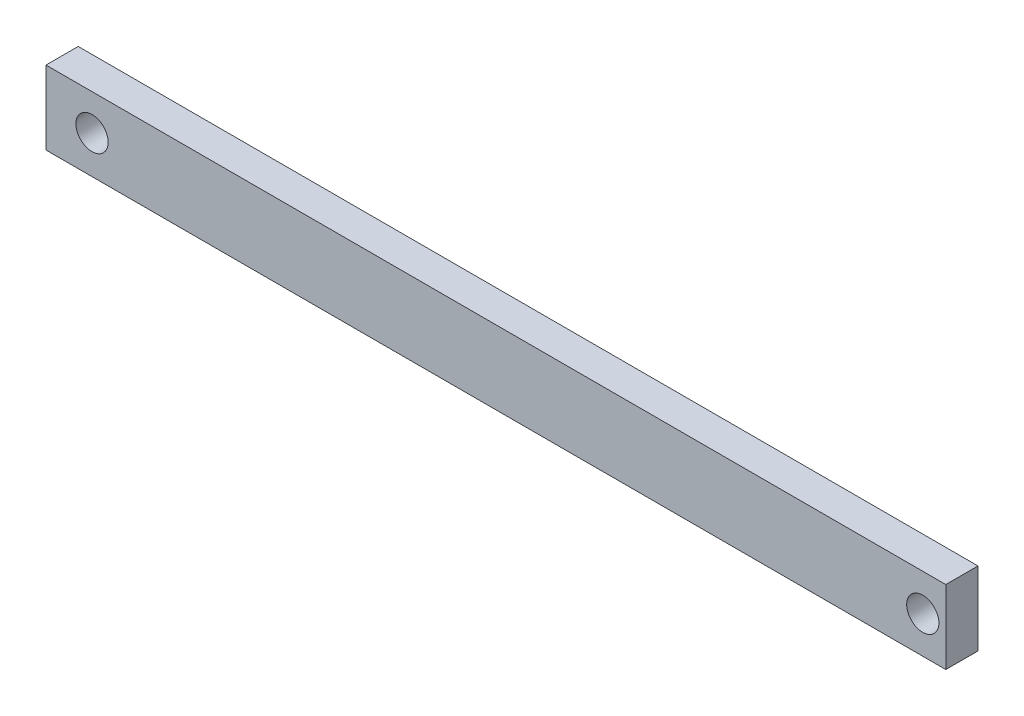
ISO-10303-21;
HEADER;
FILE_DESCRIPTION(('STEP AP214'),'2;1');
FILE_NAME('part.step','',(''),(''),'','','');
FILE_SCHEMA(('AUTOMOTIVE_DESIGN { 1 0 10303 214 1 1 1 1 }'));
ENDSEC;
DATA;
#1=APPLICATION_CONTEXT('core data for automotive mechanical design processes');
#2=APPLICATION_PROTOCOL_DEFINITION('international standard','automotive_design',2000,#1);
#3=PRODUCT_CONTEXT('',#1,'mechanical');
#4=PRODUCT('Part','Part','',(#3));
#5=PRODUCT_RELATED_PRODUCT_CATEGORY('part','',(#4));
#6=PRODUCT_DEFINITION_FORMATION('','',#4);
#7=PRODUCT_DEFINITION_CONTEXT('part definition',#1,'design');
#8=PRODUCT_DEFINITION('design','',#6,#7);
#9=PRODUCT_DEFINITION_SHAPE('','',#8);
#10=(LENGTH_UNIT() NAMED_UNIT(*) SI_UNIT(.MILLI.,.METRE.));
#11=(NAMED_UNIT(*) PLANE_ANGLE_UNIT() SI_UNIT($,.RADIAN.));
#12=(NAMED_UNIT(*) SI_UNIT($,.STERADIAN.) SOLID_ANGLE_UNIT());
#13=UNCERTAINTY_MEASURE_WITH_UNIT(LENGTH_MEASURE(1.E-05),#10,'distance_accuracy_value','');
#14=(GEOMETRIC_REPRESENTATION_CONTEXT(3) GLOBAL_UNCERTAINTY_ASSIGNED_CONTEXT((#13)) GLOBAL_UNIT_ASSIGNED_CONTEXT((#10,
#11,#12)) REPRESENTATION_CONTEXT('',''));
#15=CARTESIAN_POINT('',(0.,0.,0.));
#16=DIRECTION('',(0.,0.,1.));
#17=DIRECTION('',(1.,0.,0.));
#18=AXIS2_PLACEMENT_3D('',#15,#16,#17);
#19=CARTESIAN_POINT('',(-237.857142857143,26.2857142857143,14.));
#20=DIRECTION('',(1.,0.,0.));
#21=DIRECTION('',(0.,0.,-1.));
#22=AXIS2_PLACEMENT_3D('',#19,#20,#21);
#23=PLANE('',#22);
#24=DIRECTION('',(0.,-1.,0.));
#25=VECTOR('',#24,1.);
#26=CARTESIAN_POINT('',(-237.857142857143,26.2857142857143,0.));
#27=LINE('',#26,#25);
#28=CARTESIAN_POINT('',(-237.857142857143,26.2857142857143,0.));
#29=VERTEX_POINT('',#28);
#30=CARTESIAN_POINT('',(-237.857142857143,-5.71428571428572,0.));
#31=VERTEX_POINT('',#30);
#32=EDGE_CURVE('E102',#29,#31,#27,.T.);
#33=ORIENTED_EDGE('',*,*,#32,.T.);
#34=DIRECTION('',(0.,0.,-1.));
#35=VECTOR('',#34,1.);
#36=CARTESIAN_POINT('',(-237.857142857143,-5.71428571428572,14.));
#37=LINE('',#36,#35);
#38=CARTESIAN_POINT('',(-237.857142857143,-5.71428571428572,14.));
#39=VERTEX_POINT('',#38);
#40=EDGE_CURVE('E11',#39,#31,#37,.T.);
#41=ORIENTED_EDGE('',*,*,#40,.F.);
#42=DIRECTION('',(0.,-1.,0.));
#43=VECTOR('',#42,1.);
#44=CARTESIAN_POINT('',(-237.857142857143,26.2857142857143,14.));
#45=LINE('',#44,#43);
#46=CARTESIAN_POINT('',(-237.857142857143,26.2857142857143,14.));
#47=VERTEX_POINT('',#46);
#48=EDGE_CURVE('E90',#47,#39,#45,.T.);
#49=ORIENTED_EDGE('',*,*,#48,.F.);
#50=DIRECTION('',(0.,0.,-1.));
#51=VECTOR('',#50,1.);
#52=CARTESIAN_POINT('',(-237.857142857143,26.2857142857143,14.));
#53=LINE('',#52,#51);
#54=EDGE_CURVE('E98',#47,#29,#53,.T.);
#55=ORIENTED_EDGE('',*,*,#54,.T.);
#56=EDGE_LOOP('',(#33,#41,#49,#55));
#57=FACE_BOUND('',#56,.T.);
#58=ADVANCED_FACE('F39',(#57),#23,.F.);
#59=CARTESIAN_POINT('',(-237.857142857143,-5.71428571428572,14.));
#60=DIRECTION('',(0.,1.,0.));
#61=DIRECTION('',(0.,0.,1.));
#62=AXIS2_PLACEMENT_3D('',#59,#60,#61);
#63=PLANE('',#62);
#64=DIRECTION('',(1.,0.,0.));
#65=VECTOR('',#64,1.);
#66=CARTESIAN_POINT('',(-237.857142857143,-5.71428571428572,0.));
#67=LINE('',#66,#65);
#68=CARTESIAN_POINT('',(153.142857142857,-5.71428571428572,0.));
#69=VERTEX_POINT('',#68);
#70=EDGE_CURVE('E94',#31,#69,#67,.T.);
#71=ORIENTED_EDGE('',*,*,#70,.T.);
#72=DIRECTION('',(0.,0.,-1.));
#73=VECTOR('',#72,1.);
#74=CARTESIAN_POINT('',(153.142857142857,-5.71428571428572,14.));
#75=LINE('',#74,#73);
#76=CARTESIAN_POINT('',(153.142857142857,-5.71428571428572,14.));
#77=VERTEX_POINT('',#76);
#78=EDGE_CURVE('E47',#77,#69,#75,.T.);
#79=ORIENTED_EDGE('',*,*,#78,.F.);
#80=DIRECTION('',(1.,0.,0.));
#81=VECTOR('',#80,1.);
#82=CARTESIAN_POINT('',(-237.857142857143,-5.71428571428572,14.));
#83=LINE('',#82,#81);
#84=EDGE_CURVE('E85',#39,#77,#83,.T.);
#85=ORIENTED_EDGE('',*,*,#84,.F.);
#86=ORIENTED_EDGE('',*,*,#40,.T.);
#87=EDGE_LOOP('',(#71,#79,#85,#86));
#88=FACE_BOUND('',#87,.T.);
#89=ADVANCED_FACE('F93',(#88),#63,.F.);
#90=CARTESIAN_POINT('',(153.142857142857,26.2857142857143,14.));
#91=DIRECTION('',(-1.,0.,0.));
#92=DIRECTION('',(0.,0.,1.));
#93=AXIS2_PLACEMENT_3D('',#90,#91,#92);
#94=PLANE('',#93);
#95=DIRECTION('',(0.,1.,0.));
#96=VECTOR('',#95,1.);
#97=CARTESIAN_POINT('',(153.142857142857,26.2857142857143,0.));
#98=LINE('',#97,#96);
#99=CARTESIAN_POINT('',(153.142857142857,26.2857142857143,0.));
#100=VERTEX_POINT('',#99);
#101=EDGE_CURVE('E72',#69,#100,#98,.T.);
#102=ORIENTED_EDGE('',*,*,#101,.T.);
#103=DIRECTION('',(0.,0.,-1.));
#104=VECTOR('',#103,1.);
#105=CARTESIAN_POINT('',(153.142857142857,26.2857142857143,14.));
#106=LINE('',#105,#104);
#107=CARTESIAN_POINT('',(153.142857142857,26.2857142857143,14.));
#108=VERTEX_POINT('',#107);
#109=EDGE_CURVE('E95',#108,#100,#106,.T.);
#110=ORIENTED_EDGE('',*,*,#109,.F.);
#111=DIRECTION('',(0.,1.,0.));
#112=VECTOR('',#111,1.);
#113=CARTESIAN_POINT('',(153.142857142857,26.2857142857143,14.));
#114=LINE('',#113,#112);
#115=EDGE_CURVE('E88',#77,#108,#114,.T.);
#116=ORIENTED_EDGE('',*,*,#115,.F.);
#117=ORIENTED_EDGE('',*,*,#78,.T.);
#118=EDGE_LOOP('',(#102,#110,#116,#117));
#119=FACE_BOUND('',#118,.T.);
#120=ADVANCED_FACE('F96',(#119),#94,.F.);
#121=CARTESIAN_POINT('',(-237.857142857143,26.2857142857143,14.));
#122=DIRECTION('',(0.,-1.,0.));
#123=DIRECTION('',(1.,0.,0.));
#124=AXIS2_PLACEMENT_3D('',#121,#122,#123);
#125=PLANE('',#124);
#126=DIRECTION('',(-1.,0.,0.));
#127=VECTOR('',#126,1.);
#128=CARTESIAN_POINT('',(-237.857142857143,26.2857142857143,0.));
#129=LINE('',#128,#127);
#130=EDGE_CURVE('E78',#100,#29,#129,.T.);
#131=ORIENTED_EDGE('',*,*,#130,.T.);
#132=ORIENTED_EDGE('',*,*,#54,.F.);
#133=DIRECTION('',(-1.,0.,0.));
#134=VECTOR('',#133,1.);
#135=CARTESIAN_POINT('',(-237.857142857143,26.2857142857143,14.));
#136=LINE('',#135,#134);
#137=EDGE_CURVE('E55',#108,#47,#136,.T.);
#138=ORIENTED_EDGE('',*,*,#137,.F.);
#139=ORIENTED_EDGE('',*,*,#109,.T.);
#140=EDGE_LOOP('',(#131,#132,#138,#139));
#141=FACE_BOUND('',#140,.T.);
#142=ADVANCED_FACE('F110',(#141),#125,.F.);
#143=CARTESIAN_POINT('',(0.,0.,14.));
#144=DIRECTION('',(0.,0.,1.));
#145=DIRECTION('',(1.,0.,0.));
#146=AXIS2_PLACEMENT_3D('',#143,#144,#145);
#147=PLANE('',#146);
#148=CARTESIAN_POINT('',(143.142857142857,10.2857142857143,14.));
#149=DIRECTION('',(0.,0.,1.));
#150=DIRECTION('',(1.,0.,0.));
#151=AXIS2_PLACEMENT_3D('',#148,#149,#150);
#152=CIRCLE('',#151,7.00000000000001);
#153=CARTESIAN_POINT('',(150.142857142857,10.2857142857143,14.));
#154=VERTEX_POINT('',#153);
#155=EDGE_CURVE('E122',#154,#154,#152,.T.);
#156=ORIENTED_EDGE('',*,*,#155,.F.);
#157=EDGE_LOOP('',(#156));
#158=FACE_BOUND('',#157,.T.);
#159=CARTESIAN_POINT('',(-217.857142857143,10.6917314979543,14.));
#160=DIRECTION('',(0.,0.,1.));
#161=DIRECTION('',(1.,0.,0.));
#162=AXIS2_PLACEMENT_3D('',#159,#160,#161);
#163=CIRCLE('',#162,7.00000000000001);
#164=CARTESIAN_POINT('',(-210.857142857143,10.6917314979543,14.));
#165=VERTEX_POINT('',#164);
#166=EDGE_CURVE('E116',#165,#165,#163,.T.);
#167=ORIENTED_EDGE('',*,*,#166,.F.);
#168=EDGE_LOOP('',(#167));
#169=FACE_BOUND('',#168,.T.);
#170=ORIENTED_EDGE('',*,*,#48,.T.);
#171=ORIENTED_EDGE('',*,*,#84,.T.);
#172=ORIENTED_EDGE('',*,*,#115,.T.);
#173=ORIENTED_EDGE('',*,*,#137,.T.);
#174=EDGE_LOOP('',(#170,#171,#172,#173));
#175=FACE_BOUND('',#174,.T.);
#176=ADVANCED_FACE('F86',(#158,#169,#175),#147,.T.);
#177=CARTESIAN_POINT('',(0.,0.,0.));
#178=DIRECTION('',(0.,0.,1.));
#179=DIRECTION('',(1.,0.,0.));
#180=AXIS2_PLACEMENT_3D('',#177,#178,#179);
#181=PLANE('',#180);
#182=CARTESIAN_POINT('',(143.142857142857,10.2857142857143,0.));
#183=DIRECTION('',(0.,0.,1.));
#184=DIRECTION('',(1.,0.,0.));
#185=AXIS2_PLACEMENT_3D('',#182,#183,#184);
#186=CIRCLE('',#185,7.00000000000001);
#187=CARTESIAN_POINT('',(150.142857142857,10.2857142857143,0.));
#188=VERTEX_POINT('',#187);
#189=EDGE_CURVE('E119',#188,#188,#186,.T.);
#190=ORIENTED_EDGE('',*,*,#189,.T.);
#191=EDGE_LOOP('',(#190));
#192=FACE_BOUND('',#191,.T.);
#193=CARTESIAN_POINT('',(-217.857142857143,10.6917314979543,0.));
#194=DIRECTION('',(0.,0.,1.));
#195=DIRECTION('',(1.,0.,0.));
#196=AXIS2_PLACEMENT_3D('',#193,#194,#195);
#197=CIRCLE('',#196,7.00000000000001);
#198=CARTESIAN_POINT('',(-210.857142857143,10.6917314979543,0.));
#199=VERTEX_POINT('',#198);
#200=EDGE_CURVE('E105',#199,#199,#197,.T.);
#201=ORIENTED_EDGE('',*,*,#200,.T.);
#202=EDGE_LOOP('',(#201));
#203=FACE_BOUND('',#202,.T.);
#204=ORIENTED_EDGE('',*,*,#32,.F.);
#205=ORIENTED_EDGE('',*,*,#130,.F.);
#206=ORIENTED_EDGE('',*,*,#101,.F.);
#207=ORIENTED_EDGE('',*,*,#70,.F.);
#208=EDGE_LOOP('',(#204,#205,#206,#207));
#209=FACE_BOUND('',#208,.T.);
#210=ADVANCED_FACE('F113',(#192,#203,#209),#181,.F.);
#211=CARTESIAN_POINT('',(-217.857142857143,10.6917314979543,0.));
#212=DIRECTION('',(0.,0.,1.));
#213=DIRECTION('',(1.,0.,0.));
#214=AXIS2_PLACEMENT_3D('',#211,#212,#213);
#215=CYLINDRICAL_SURFACE('',#214,7.00000000000001);
#216=CARTESIAN_POINT('',(-210.857142857143,10.6917314979543,0.));
#217=CARTESIAN_POINT('',(-210.857142857143,10.6917314979543,0.145833333333333));
#218=CARTESIAN_POINT('',(-210.857142857143,10.6917314979543,0.291666666666667));
#219=CARTESIAN_POINT('',(-210.857142857143,10.6917314979543,0.583333333333333));
#220=CARTESIAN_POINT('',(-210.857142857143,10.6917314979543,0.729166666666667));
#221=CARTESIAN_POINT('',(-210.857142857143,10.6917314979543,1.02083333333333));
#222=CARTESIAN_POINT('',(-210.857142857143,10.6917314979543,1.16666666666667));
#223=CARTESIAN_POINT('',(-210.857142857143,10.6917314979543,1.45833333333333));
#224=CARTESIAN_POINT('',(-210.857142857143,10.6917314979543,1.60416666666667));
#225=CARTESIAN_POINT('',(-210.857142857143,10.6917314979543,1.89583333333333));
#226=CARTESIAN_POINT('',(-210.857142857143,10.6917314979543,2.04166666666667));
#227=CARTESIAN_POINT('',(-210.857142857143,10.6917314979543,2.33333333333333));
#228=CARTESIAN_POINT('',(-210.857142857143,10.6917314979543,2.47916666666667));
#229=CARTESIAN_POINT('',(-210.857142857143,10.6917314979543,2.77083333333333));
#230=CARTESIAN_POINT('',(-210.857142857143,10.6917314979543,2.91666666666667));
#231=CARTESIAN_POINT('',(-210.857142857143,10.6917314979543,3.20833333333333));
#232=CARTESIAN_POINT('',(-210.857142857143,10.6917314979543,3.35416666666667));
#233=CARTESIAN_POINT('',(-210.857142857143,10.6917314979543,3.64583333333333));
#234=CARTESIAN_POINT('',(-210.857142857143,10.6917314979543,3.79166666666667));
#235=CARTESIAN_POINT('',(-210.857142857143,10.6917314979543,4.08333333333333));
#236=CARTESIAN_POINT('',(-210.857142857143,10.6917314979543,4.22916666666667));
#237=CARTESIAN_POINT('',(-210.857142857143,10.6917314979543,4.52083333333333));
#238=CARTESIAN_POINT('',(-210.857142857143,10.6917314979543,4.66666666666667));
#239=CARTESIAN_POINT('',(-210.857142857143,10.6917314979543,4.95833333333333));
#240=CARTESIAN_POINT('',(-210.857142857143,10.6917314979543,5.10416666666667));
#241=CARTESIAN_POINT('',(-210.857142857143,10.6917314979543,5.39583333333333));
#242=CARTESIAN_POINT('',(-210.857142857143,10.6917314979543,5.54166666666667));
#243=CARTESIAN_POINT('',(-210.857142857143,10.6917314979543,5.83333333333333));
#244=CARTESIAN_POINT('',(-210.857142857143,10.6917314979543,5.97916666666667));
#245=CARTESIAN_POINT('',(-210.857142857143,10.6917314979543,6.27083333333333));
#246=CARTESIAN_POINT('',(-210.857142857143,10.6917314979543,6.41666666666667));
#247=CARTESIAN_POINT('',(-210.857142857143,10.6917314979543,6.70833333333333));
#248=CARTESIAN_POINT('',(-210.857142857143,10.6917314979543,6.85416666666666));
#249=CARTESIAN_POINT('',(-210.857142857143,10.6917314979543,7.14583333333333));
#250=CARTESIAN_POINT('',(-210.857142857143,10.6917314979543,7.29166666666667));
#251=CARTESIAN_POINT('',(-210.857142857143,10.6917314979543,7.58333333333333));
#252=CARTESIAN_POINT('',(-210.857142857143,10.6917314979543,7.72916666666667));
#253=CARTESIAN_POINT('',(-210.857142857143,10.6917314979543,8.02083333333333));
#254=CARTESIAN_POINT('',(-210.857142857143,10.6917314979543,8.16666666666666));
#255=CARTESIAN_POINT('',(-210.857142857143,10.6917314979543,8.45833333333333));
#256=CARTESIAN_POINT('',(-210.857142857143,10.6917314979543,8.60416666666666));
#257=CARTESIAN_POINT('',(-210.857142857143,10.6917314979543,8.89583333333333));
#258=CARTESIAN_POINT('',(-210.857142857143,10.6917314979543,9.04166666666666));
#259=CARTESIAN_POINT('',(-210.857142857143,10.6917314979543,9.33333333333333));
#260=CARTESIAN_POINT('',(-210.857142857143,10.6917314979543,9.47916666666666));
#261=CARTESIAN_POINT('',(-210.857142857143,10.6917314979543,9.77083333333333));
#262=CARTESIAN_POINT('',(-210.857142857143,10.6917314979543,9.91666666666666));
#263=CARTESIAN_POINT('',(-210.857142857143,10.6917314979543,10.2083333333333));
#264=CARTESIAN_POINT('',(-210.857142857143,10.6917314979543,10.3541666666667));
#265=CARTESIAN_POINT('',(-210.857142857143,10.6917314979543,10.6458333333333));
#266=CARTESIAN_POINT('',(-210.857142857143,10.6917314979543,10.7916666666667));
#267=CARTESIAN_POINT('',(-210.857142857143,10.6917314979543,11.0833333333333));
#268=CARTESIAN_POINT('',(-210.857142857143,10.6917314979543,11.2291666666667));
#269=CARTESIAN_POINT('',(-210.857142857143,10.6917314979543,11.5208333333333));
#270=CARTESIAN_POINT('',(-210.857142857143,10.6917314979543,11.6666666666667));
#271=CARTESIAN_POINT('',(-210.857142857143,10.6917314979543,11.9583333333333));
#272=CARTESIAN_POINT('',(-210.857142857143,10.6917314979543,12.1041666666667));
#273=CARTESIAN_POINT('',(-210.857142857143,10.6917314979543,12.3958333333333));
#274=CARTESIAN_POINT('',(-210.857142857143,10.6917314979543,12.5416666666667));
#275=CARTESIAN_POINT('',(-210.857142857143,10.6917314979543,12.8333333333333));
#276=CARTESIAN_POINT('',(-210.857142857143,10.6917314979543,12.9791666666667));
#277=CARTESIAN_POINT('',(-210.857142857143,10.6917314979543,13.2708333333333));
#278=CARTESIAN_POINT('',(-210.857142857143,10.6917314979543,13.4166666666667));
#279=CARTESIAN_POINT('',(-210.857142857143,10.6917314979543,13.7083333333333));
#280=CARTESIAN_POINT('',(-210.857142857143,10.6917314979543,13.8541666666667));
#281=CARTESIAN_POINT('',(-210.857142857143,10.6917314979543,14.));
#282=B_SPLINE_CURVE_WITH_KNOTS('',3,(#216,#217,#218,#219,#220,#221,#222,#223,#224,#225,#226,
#227,#228,#229,#230,#231,#232,#233,#234,#235,#236,#237,#238,#239,#240,#241,#242,#243,#244,#245,
#246,#247,#248,#249,#250,#251,#252,#253,#254,#255,#256,#257,#258,#259,#260,#261,#262,#263,#264,
#265,#266,#267,#268,#269,#270,#271,#272,#273,#274,#275,#276,#277,#278,#279,#280,#281),
.UNSPECIFIED.,.F.,.F.,(4,2,2,2,2,2,2,2,2,2,2,2,2,2,2,2,2,2,2,2,2,2,2,2,2,2,2,2,2,2,2,2,4),(0.,
0.4375,0.875,1.3125,1.75,2.1875,2.625,3.0625,3.5,3.9375,4.375,4.8125,5.25,5.6875,6.125,6.5625,
7.,7.4375,7.875,8.3125,8.75,9.1875,9.625,10.0625,10.5,10.9375,11.375,11.8125,12.25,12.6875,
13.125,13.5625,14.),.UNSPECIFIED.);
#283=EDGE_CURVE('BSEAM133',#199,#165,#282,.T.);
#284=ORIENTED_EDGE('',*,*,#200,.F.);
#285=ORIENTED_EDGE('',*,*,#166,.T.);
#286=ORIENTED_EDGE('',*,*,#283,.T.);
#287=ORIENTED_EDGE('',*,*,#283,.F.);
#288=EDGE_LOOP('',(#284,#286,#285,#287));
#289=FACE_BOUND('',#288,.T.);
#290=ADVANCED_FACE('F133',(#289),#215,.F.);
#291=CARTESIAN_POINT('',(143.142857142857,10.2857142857143,0.));
#292=DIRECTION('',(0.,0.,1.));
#293=DIRECTION('',(1.,0.,0.));
#294=AXIS2_PLACEMENT_3D('',#291,#292,#293);
#295=CYLINDRICAL_SURFACE('',#294,7.00000000000001);
#296=CARTESIAN_POINT('',(150.142857142857,10.2857142857143,0.));
#297=CARTESIAN_POINT('',(150.142857142857,10.2857142857143,0.145833333333333));
#298=CARTESIAN_POINT('',(150.142857142857,10.2857142857143,0.291666666666667));
#299=CARTESIAN_POINT('',(150.142857142857,10.2857142857143,0.583333333333333));
#300=CARTESIAN_POINT('',(150.142857142857,10.2857142857143,0.729166666666667));
#301=CARTESIAN_POINT('',(150.142857142857,10.2857142857143,1.02083333333333));
#302=CARTESIAN_POINT('',(150.142857142857,10.2857142857143,1.16666666666667));
#303=CARTESIAN_POINT('',(150.142857142857,10.2857142857143,1.45833333333333));
#304=CARTESIAN_POINT('',(150.142857142857,10.2857142857143,1.60416666666667));
#305=CARTESIAN_POINT('',(150.142857142857,10.2857142857143,1.89583333333333));
#306=CARTESIAN_POINT('',(150.142857142857,10.2857142857143,2.04166666666667));
#307=CARTESIAN_POINT('',(150.142857142857,10.2857142857143,2.33333333333333));
#308=CARTESIAN_POINT('',(150.142857142857,10.2857142857143,2.47916666666667));
#309=CARTESIAN_POINT('',(150.142857142857,10.2857142857143,2.77083333333333));
#310=CARTESIAN_POINT('',(150.142857142857,10.2857142857143,2.91666666666667));
#311=CARTESIAN_POINT('',(150.142857142857,10.2857142857143,3.20833333333333));
#312=CARTESIAN_POINT('',(150.142857142857,10.2857142857143,3.35416666666667));
#313=CARTESIAN_POINT('',(150.142857142857,10.2857142857143,3.64583333333333));
#314=CARTESIAN_POINT('',(150.142857142857,10.2857142857143,3.79166666666667));
#315=CARTESIAN_POINT('',(150.142857142857,10.2857142857143,4.08333333333333));
#316=CARTESIAN_POINT('',(150.142857142857,10.2857142857143,4.22916666666667));
#317=CARTESIAN_POINT('',(150.142857142857,10.2857142857143,4.52083333333333));
#318=CARTESIAN_POINT('',(150.142857142857,10.2857142857143,4.66666666666667));
#319=CARTESIAN_POINT('',(150.142857142857,10.2857142857143,4.95833333333333));
#320=CARTESIAN_POINT('',(150.142857142857,10.2857142857143,5.10416666666667));
#321=CARTESIAN_POINT('',(150.142857142857,10.2857142857143,5.39583333333333));
#322=CARTESIAN_POINT('',(150.142857142857,10.2857142857143,5.54166666666667));
#323=CARTESIAN_POINT('',(150.142857142857,10.2857142857143,5.83333333333333));
#324=CARTESIAN_POINT('',(150.142857142857,10.2857142857143,5.97916666666667));
#325=CARTESIAN_POINT('',(150.142857142857,10.2857142857143,6.27083333333333));
#326=CARTESIAN_POINT('',(150.142857142857,10.2857142857143,6.41666666666667));
#327=CARTESIAN_POINT('',(150.142857142857,10.2857142857143,6.70833333333333));
#328=CARTESIAN_POINT('',(150.142857142857,10.2857142857143,6.85416666666666));
#329=CARTESIAN_POINT('',(150.142857142857,10.2857142857143,7.14583333333333));
#330=CARTESIAN_POINT('',(150.142857142857,10.2857142857143,7.29166666666667));
#331=CARTESIAN_POINT('',(150.142857142857,10.2857142857143,7.58333333333333));
#332=CARTESIAN_POINT('',(150.142857142857,10.2857142857143,7.72916666666667));
#333=CARTESIAN_POINT('',(150.142857142857,10.2857142857143,8.02083333333333));
#334=CARTESIAN_POINT('',(150.142857142857,10.2857142857143,8.16666666666666));
#335=CARTESIAN_POINT('',(150.142857142857,10.2857142857143,8.45833333333333));
#336=CARTESIAN_POINT('',(150.142857142857,10.2857142857143,8.60416666666666));
#337=CARTESIAN_POINT('',(150.142857142857,10.2857142857143,8.89583333333333));
#338=CARTESIAN_POINT('',(150.142857142857,10.2857142857143,9.04166666666666));
#339=CARTESIAN_POINT('',(150.142857142857,10.2857142857143,9.33333333333333));
#340=CARTESIAN_POINT('',(150.142857142857,10.2857142857143,9.47916666666666));
#341=CARTESIAN_POINT('',(150.142857142857,10.2857142857143,9.77083333333333));
#342=CARTESIAN_POINT('',(150.142857142857,10.2857142857143,9.91666666666666));
#343=CARTESIAN_POINT('',(150.142857142857,10.2857142857143,10.2083333333333));
#344=CARTESIAN_POINT('',(150.142857142857,10.2857142857143,10.3541666666667));
#345=CARTESIAN_POINT('',(150.142857142857,10.2857142857143,10.6458333333333));
#346=CARTESIAN_POINT('',(150.142857142857,10.2857142857143,10.7916666666667));
#347=CARTESIAN_POINT('',(150.142857142857,10.2857142857143,11.0833333333333));
#348=CARTESIAN_POINT('',(150.142857142857,10.2857142857143,11.2291666666667));
#349=CARTESIAN_POINT('',(150.142857142857,10.2857142857143,11.5208333333333));
#350=CARTESIAN_POINT('',(150.142857142857,10.2857142857143,11.6666666666667));
#351=CARTESIAN_POINT('',(150.142857142857,10.2857142857143,11.9583333333333));
#352=CARTESIAN_POINT('',(150.142857142857,10.2857142857143,12.1041666666667));
#353=CARTESIAN_POINT('',(150.142857142857,10.2857142857143,12.3958333333333));
#354=CARTESIAN_POINT('',(150.142857142857,10.2857142857143,12.5416666666667));
#355=CARTESIAN_POINT('',(150.142857142857,10.2857142857143,12.8333333333333));
#356=CARTESIAN_POINT('',(150.142857142857,10.2857142857143,12.9791666666667));
#357=CARTESIAN_POINT('',(150.142857142857,10.2857142857143,13.2708333333333));
#358=CARTESIAN_POINT('',(150.142857142857,10.2857142857143,13.4166666666667));
#359=CARTESIAN_POINT('',(150.142857142857,10.2857142857143,13.7083333333333));
#360=CARTESIAN_POINT('',(150.142857142857,10.2857142857143,13.8541666666667));
#361=CARTESIAN_POINT('',(150.142857142857,10.2857142857143,14.));
#362=B_SPLINE_CURVE_WITH_KNOTS('',3,(#296,#297,#298,#299,#300,#301,#302,#303,#304,#305,#306,
#307,#308,#309,#310,#311,#312,#313,#314,#315,#316,#317,#318,#319,#320,#321,#322,#323,#324,#325,
#326,#327,#328,#329,#330,#331,#332,#333,#334,#335,#336,#337,#338,#339,#340,#341,#342,#343,#344,
#345,#346,#347,#348,#349,#350,#351,#352,#353,#354,#355,#356,#357,#358,#359,#360,#361),
.UNSPECIFIED.,.F.,.F.,(4,2,2,2,2,2,2,2,2,2,2,2,2,2,2,2,2,2,2,2,2,2,2,2,2,2,2,2,2,2,2,2,4),(0.,
0.4375,0.875,1.3125,1.75,2.1875,2.625,3.0625,3.5,3.9375,4.375,4.8125,5.25,5.6875,6.125,6.5625,
7.,7.4375,7.875,8.3125,8.75,9.1875,9.625,10.0625,10.5,10.9375,11.375,11.8125,12.25,12.6875,
13.125,13.5625,14.),.UNSPECIFIED.);
#363=EDGE_CURVE('BSEAM130',#188,#154,#362,.T.);
#364=ORIENTED_EDGE('',*,*,#189,.F.);
#365=ORIENTED_EDGE('',*,*,#155,.T.);
#366=ORIENTED_EDGE('',*,*,#363,.T.);
#367=ORIENTED_EDGE('',*,*,#363,.F.);
#368=EDGE_LOOP('',(#364,#366,#365,#367));
#369=FACE_BOUND('',#368,.T.);
#370=ADVANCED_FACE('F130',(#369),#295,.F.);
#371=CLOSED_SHELL('',(#58,#89,#120,#142,#176,#210,#290,#370));
#372=MANIFOLD_SOLID_BREP('B2',#371);
#373=ADVANCED_BREP_SHAPE_REPRESENTATION('',(#18,#372),#14);
#374=SHAPE_DEFINITION_REPRESENTATION(#9,#373);
ENDSEC;
END-ISO-10303-21;
